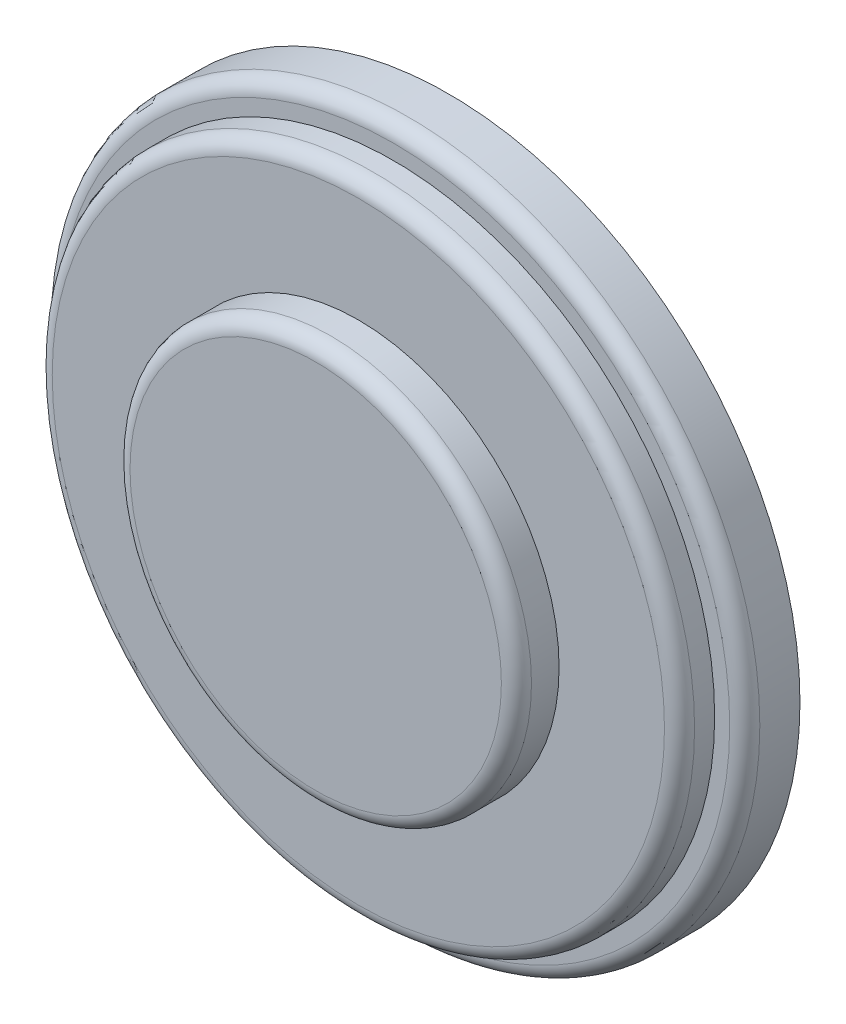
ISO-10303-21;
HEADER;
FILE_DESCRIPTION(('STEP AP214'),'2;1');
FILE_NAME('part.step','',(''),(''),'','','');
FILE_SCHEMA(('AUTOMOTIVE_DESIGN { 1 0 10303 214 1 1 1 1 }'));
ENDSEC;
DATA;
#1=APPLICATION_CONTEXT('core data for automotive mechanical design processes');
#2=APPLICATION_PROTOCOL_DEFINITION('international standard','automotive_design',2000,#1);
#3=PRODUCT_CONTEXT('',#1,'mechanical');
#4=PRODUCT('Part','Part','',(#3));
#5=PRODUCT_RELATED_PRODUCT_CATEGORY('part','',(#4));
#6=PRODUCT_DEFINITION_FORMATION('','',#4);
#7=PRODUCT_DEFINITION_CONTEXT('part definition',#1,'design');
#8=PRODUCT_DEFINITION('design','',#6,#7);
#9=PRODUCT_DEFINITION_SHAPE('','',#8);
#10=(LENGTH_UNIT() NAMED_UNIT(*) SI_UNIT(.MILLI.,.METRE.));
#11=(NAMED_UNIT(*) PLANE_ANGLE_UNIT() SI_UNIT($,.RADIAN.));
#12=(NAMED_UNIT(*) SI_UNIT($,.STERADIAN.) SOLID_ANGLE_UNIT());
#13=UNCERTAINTY_MEASURE_WITH_UNIT(LENGTH_MEASURE(1.E-05),#10,'distance_accuracy_value','');
#14=(GEOMETRIC_REPRESENTATION_CONTEXT(3) GLOBAL_UNCERTAINTY_ASSIGNED_CONTEXT((#13)) GLOBAL_UNIT_ASSIGNED_CONTEXT((#10,
#11,#12)) REPRESENTATION_CONTEXT('',''));
#15=CARTESIAN_POINT('',(0.,0.,0.));
#16=DIRECTION('',(0.,0.,1.));
#17=DIRECTION('',(1.,0.,0.));
#18=AXIS2_PLACEMENT_3D('',#15,#16,#17);
#19=CARTESIAN_POINT('',(0.,0.,2.2));
#20=DIRECTION('',(0.,0.,-1.));
#21=DIRECTION('',(-1.,0.,0.));
#22=AXIS2_PLACEMENT_3D('',#19,#20,#21);
#23=CYLINDRICAL_SURFACE('',#22,14.);
#24=CARTESIAN_POINT('',(0.,0.,1.6));
#25=DIRECTION('',(0.,0.,1.));
#26=DIRECTION('',(1.,0.,0.));
#27=AXIS2_PLACEMENT_3D('',#24,#25,#26);
#28=CIRCLE('',#27,14.);
#29=CARTESIAN_POINT('',(14.,0.,1.6));
#30=VERTEX_POINT('',#29);
#31=EDGE_CURVE('E10',#30,#30,#28,.F.);
#32=ORIENTED_EDGE('',*,*,#31,.T.);
#33=EDGE_LOOP('',(#32));
#34=FACE_BOUND('',#33,.T.);
#35=CARTESIAN_POINT('',(0.,0.,0.));
#36=DIRECTION('',(0.,0.,1.));
#37=DIRECTION('',(1.,0.,0.));
#38=AXIS2_PLACEMENT_3D('',#35,#36,#37);
#39=CIRCLE('',#38,14.);
#40=CARTESIAN_POINT('',(14.,0.,0.));
#41=VERTEX_POINT('',#40);
#42=EDGE_CURVE('E58',#41,#41,#39,.T.);
#43=ORIENTED_EDGE('',*,*,#42,.T.);
#44=EDGE_LOOP('',(#43));
#45=FACE_BOUND('',#44,.T.);
#46=ADVANCED_FACE('F31',(#34,#45),#23,.T.);
#47=CARTESIAN_POINT('',(0.,0.,2.2));
#48=DIRECTION('',(0.,0.,1.));
#49=DIRECTION('',(1.,0.,0.));
#50=AXIS2_PLACEMENT_3D('',#47,#48,#49);
#51=PLANE('',#50);
#52=CARTESIAN_POINT('',(0.,0.,2.2));
#53=DIRECTION('',(0.,0.,1.));
#54=DIRECTION('',(1.,0.,0.));
#55=AXIS2_PLACEMENT_3D('',#52,#53,#54);
#56=CIRCLE('',#55,13.4);
#57=CARTESIAN_POINT('',(13.4,0.,2.2));
#58=VERTEX_POINT('',#57);
#59=EDGE_CURVE('E38',#58,#58,#56,.T.);
#60=ORIENTED_EDGE('',*,*,#59,.T.);
#61=EDGE_LOOP('',(#60));
#62=FACE_BOUND('',#61,.T.);
#63=CARTESIAN_POINT('',(0.,0.,2.2));
#64=DIRECTION('',(0.,0.,1.));
#65=DIRECTION('',(1.,0.,0.));
#66=AXIS2_PLACEMENT_3D('',#63,#64,#65);
#67=CIRCLE('',#66,12.8);
#68=CARTESIAN_POINT('',(12.8,0.,2.2));
#69=VERTEX_POINT('',#68);
#70=EDGE_CURVE('E61',#69,#69,#67,.T.);
#71=ORIENTED_EDGE('',*,*,#70,.F.);
#72=EDGE_LOOP('',(#71));
#73=FACE_BOUND('',#72,.T.);
#74=ADVANCED_FACE('F86',(#62,#73),#51,.T.);
#75=CARTESIAN_POINT('',(0.,0.,0.));
#76=DIRECTION('',(0.,0.,1.));
#77=DIRECTION('',(1.,0.,0.));
#78=AXIS2_PLACEMENT_3D('',#75,#76,#77);
#79=PLANE('',#78);
#80=CARTESIAN_POINT('',(0.,0.,0.));
#81=DIRECTION('',(0.,0.,-1.));
#82=DIRECTION('',(-1.,0.,0.));
#83=AXIS2_PLACEMENT_3D('',#80,#81,#82);
#84=CIRCLE('',#83,12.5);
#85=CARTESIAN_POINT('',(-12.5,0.,0.));
#86=VERTEX_POINT('',#85);
#87=EDGE_CURVE('E67',#86,#86,#84,.T.);
#88=ORIENTED_EDGE('',*,*,#87,.F.);
#89=EDGE_LOOP('',(#88));
#90=FACE_BOUND('',#89,.T.);
#91=ORIENTED_EDGE('',*,*,#42,.F.);
#92=EDGE_LOOP('',(#91));
#93=FACE_BOUND('',#92,.T.);
#94=ADVANCED_FACE('F82',(#90,#93),#79,.F.);
#95=CARTESIAN_POINT('',(0.,0.,3.6));
#96=DIRECTION('',(0.,0.,-1.));
#97=DIRECTION('',(-1.,0.,0.));
#98=AXIS2_PLACEMENT_3D('',#95,#96,#97);
#99=CYLINDRICAL_SURFACE('',#98,12.8);
#100=CARTESIAN_POINT('',(0.,0.,3.));
#101=DIRECTION('',(0.,0.,1.));
#102=DIRECTION('',(1.,0.,0.));
#103=AXIS2_PLACEMENT_3D('',#100,#101,#102);
#104=CIRCLE('',#103,12.8);
#105=CARTESIAN_POINT('',(12.8,0.,3.));
#106=VERTEX_POINT('',#105);
#107=EDGE_CURVE('E42',#106,#106,#104,.F.);
#108=ORIENTED_EDGE('',*,*,#107,.T.);
#109=EDGE_LOOP('',(#108));
#110=FACE_BOUND('',#109,.T.);
#111=ORIENTED_EDGE('',*,*,#70,.T.);
#112=EDGE_LOOP('',(#111));
#113=FACE_BOUND('',#112,.T.);
#114=ADVANCED_FACE('F85',(#110,#113),#99,.T.);
#115=CARTESIAN_POINT('',(0.,0.,3.6));
#116=DIRECTION('',(0.,0.,1.));
#117=DIRECTION('',(1.,0.,0.));
#118=AXIS2_PLACEMENT_3D('',#115,#116,#117);
#119=PLANE('',#118);
#120=CARTESIAN_POINT('',(0.,0.,3.6));
#121=DIRECTION('',(0.,0.,1.));
#122=DIRECTION('',(1.,0.,0.));
#123=AXIS2_PLACEMENT_3D('',#120,#121,#122);
#124=CIRCLE('',#123,12.2);
#125=CARTESIAN_POINT('',(12.2,0.,3.6));
#126=VERTEX_POINT('',#125);
#127=EDGE_CURVE('E46',#126,#126,#124,.T.);
#128=ORIENTED_EDGE('',*,*,#127,.T.);
#129=EDGE_LOOP('',(#128));
#130=FACE_BOUND('',#129,.T.);
#131=CARTESIAN_POINT('',(0.,0.,3.6));
#132=DIRECTION('',(0.,0.,1.));
#133=DIRECTION('',(1.,0.,0.));
#134=AXIS2_PLACEMENT_3D('',#131,#132,#133);
#135=CIRCLE('',#134,8.);
#136=CARTESIAN_POINT('',(8.,0.,3.6));
#137=VERTEX_POINT('',#136);
#138=EDGE_CURVE('E57',#137,#137,#135,.T.);
#139=ORIENTED_EDGE('',*,*,#138,.F.);
#140=EDGE_LOOP('',(#139));
#141=FACE_BOUND('',#140,.T.);
#142=ADVANCED_FACE('F111',(#130,#141),#119,.T.);
#143=CARTESIAN_POINT('',(0.,0.,5.3));
#144=DIRECTION('',(0.,0.,-1.));
#145=DIRECTION('',(-1.,0.,0.));
#146=AXIS2_PLACEMENT_3D('',#143,#144,#145);
#147=CYLINDRICAL_SURFACE('',#146,8.);
#148=CARTESIAN_POINT('',(0.,0.,4.7));
#149=DIRECTION('',(0.,0.,1.));
#150=DIRECTION('',(1.,0.,0.));
#151=AXIS2_PLACEMENT_3D('',#148,#149,#150);
#152=CIRCLE('',#151,8.);
#153=CARTESIAN_POINT('',(8.,0.,4.7));
#154=VERTEX_POINT('',#153);
#155=EDGE_CURVE('E51',#154,#154,#152,.F.);
#156=ORIENTED_EDGE('',*,*,#155,.T.);
#157=EDGE_LOOP('',(#156));
#158=FACE_BOUND('',#157,.T.);
#159=ORIENTED_EDGE('',*,*,#138,.T.);
#160=EDGE_LOOP('',(#159));
#161=FACE_BOUND('',#160,.T.);
#162=ADVANCED_FACE('F114',(#158,#161),#147,.T.);
#163=CARTESIAN_POINT('',(0.,0.,5.3));
#164=DIRECTION('',(0.,0.,1.));
#165=DIRECTION('',(1.,0.,0.));
#166=AXIS2_PLACEMENT_3D('',#163,#164,#165);
#167=PLANE('',#166);
#168=CARTESIAN_POINT('',(0.,0.,5.3));
#169=DIRECTION('',(0.,0.,1.));
#170=DIRECTION('',(1.,0.,0.));
#171=AXIS2_PLACEMENT_3D('',#168,#169,#170);
#172=CIRCLE('',#171,7.4);
#173=CARTESIAN_POINT('',(7.4,0.,5.3));
#174=VERTEX_POINT('',#173);
#175=EDGE_CURVE('E54',#174,#174,#172,.T.);
#176=ORIENTED_EDGE('',*,*,#175,.T.);
#177=EDGE_LOOP('',(#176));
#178=FACE_BOUND('',#177,.T.);
#179=ADVANCED_FACE('F78',(#178),#167,.T.);
#180=CARTESIAN_POINT('',(0.,0.,1.));
#181=DIRECTION('',(0.,0.,-1.));
#182=DIRECTION('',(-1.,0.,0.));
#183=AXIS2_PLACEMENT_3D('',#180,#181,#182);
#184=CYLINDRICAL_SURFACE('',#183,12.5);
#185=CARTESIAN_POINT('',(0.,0.,1.));
#186=DIRECTION('',(0.,0.,-1.));
#187=DIRECTION('',(-1.,0.,0.));
#188=AXIS2_PLACEMENT_3D('',#185,#186,#187);
#189=CIRCLE('',#188,12.5);
#190=CARTESIAN_POINT('',(-12.5,0.,1.));
#191=VERTEX_POINT('',#190);
#192=EDGE_CURVE('E62',#191,#191,#189,.T.);
#193=ORIENTED_EDGE('',*,*,#192,.F.);
#194=EDGE_LOOP('',(#193));
#195=FACE_BOUND('',#194,.T.);
#196=ORIENTED_EDGE('',*,*,#87,.T.);
#197=EDGE_LOOP('',(#196));
#198=FACE_BOUND('',#197,.T.);
#199=ADVANCED_FACE('F75',(#195,#198),#184,.F.);
#200=CARTESIAN_POINT('',(0.,0.,1.));
#201=DIRECTION('',(0.,0.,-1.));
#202=DIRECTION('',(-1.,0.,0.));
#203=AXIS2_PLACEMENT_3D('',#200,#201,#202);
#204=PLANE('',#203);
#205=ORIENTED_EDGE('',*,*,#192,.T.);
#206=EDGE_LOOP('',(#205));
#207=FACE_BOUND('',#206,.T.);
#208=ADVANCED_FACE('F73',(#207),#204,.T.);
#209=CARTESIAN_POINT('',(0.,0.,4.7));
#210=DIRECTION('',(0.,0.,1.));
#211=DIRECTION('',(1.,0.,0.));
#212=AXIS2_PLACEMENT_3D('',#209,#210,#211);
#213=TOROIDAL_SURFACE('',#212,7.4,0.6);
#214=ORIENTED_EDGE('',*,*,#155,.F.);
#215=EDGE_LOOP('',(#214));
#216=FACE_BOUND('',#215,.T.);
#217=ORIENTED_EDGE('',*,*,#175,.F.);
#218=EDGE_LOOP('',(#217));
#219=FACE_BOUND('',#218,.T.);
#220=ADVANCED_FACE('F97',(#216,#219),#213,.T.);
#221=CARTESIAN_POINT('',(0.,0.,3.));
#222=DIRECTION('',(0.,0.,1.));
#223=DIRECTION('',(1.,0.,0.));
#224=AXIS2_PLACEMENT_3D('',#221,#222,#223);
#225=TOROIDAL_SURFACE('',#224,12.2,0.6);
#226=ORIENTED_EDGE('',*,*,#107,.F.);
#227=EDGE_LOOP('',(#226));
#228=FACE_BOUND('',#227,.T.);
#229=ORIENTED_EDGE('',*,*,#127,.F.);
#230=EDGE_LOOP('',(#229));
#231=FACE_BOUND('',#230,.T.);
#232=ADVANCED_FACE('F99',(#228,#231),#225,.T.);
#233=CARTESIAN_POINT('',(0.,0.,1.6));
#234=DIRECTION('',(0.,0.,1.));
#235=DIRECTION('',(1.,0.,0.));
#236=AXIS2_PLACEMENT_3D('',#233,#234,#235);
#237=TOROIDAL_SURFACE('',#236,13.4,0.6);
#238=ORIENTED_EDGE('',*,*,#31,.F.);
#239=EDGE_LOOP('',(#238));
#240=FACE_BOUND('',#239,.T.);
#241=ORIENTED_EDGE('',*,*,#59,.F.);
#242=EDGE_LOOP('',(#241));
#243=FACE_BOUND('',#242,.T.);
#244=ADVANCED_FACE('F33',(#240,#243),#237,.T.);
#245=CLOSED_SHELL('',(#46,#74,#94,#114,#142,#162,#179,#199,#208,#220,#232,#244));
#246=MANIFOLD_SOLID_BREP('B2',#245);
#247=ADVANCED_BREP_SHAPE_REPRESENTATION('',(#18,#246),#14);
#248=SHAPE_DEFINITION_REPRESENTATION(#9,#247);
ENDSEC;
END-ISO-10303-21;
